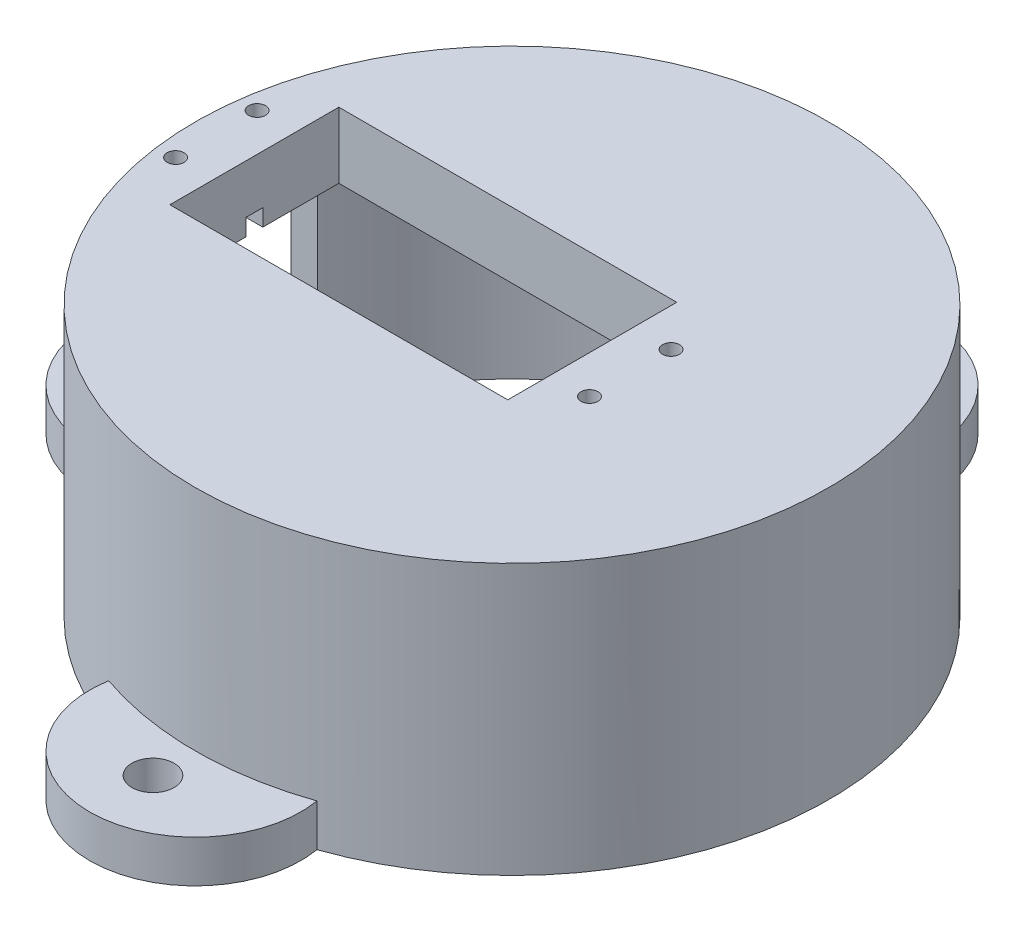
ISO-10303-21;
HEADER;
FILE_DESCRIPTION(('STEP AP214'),'2;1');
FILE_NAME('part.step','',(''),(''),'','','');
FILE_SCHEMA(('AUTOMOTIVE_DESIGN { 1 0 10303 214 1 1 1 1 }'));
ENDSEC;
DATA;
#1=APPLICATION_CONTEXT('core data for automotive mechanical design processes');
#2=APPLICATION_PROTOCOL_DEFINITION('international standard','automotive_design',2000,#1);
#3=PRODUCT_CONTEXT('',#1,'mechanical');
#4=PRODUCT('Part','Part','',(#3));
#5=PRODUCT_RELATED_PRODUCT_CATEGORY('part','',(#4));
#6=PRODUCT_DEFINITION_FORMATION('','',#4);
#7=PRODUCT_DEFINITION_CONTEXT('part definition',#1,'design');
#8=PRODUCT_DEFINITION('design','',#6,#7);
#9=PRODUCT_DEFINITION_SHAPE('','',#8);
#10=(LENGTH_UNIT() NAMED_UNIT(*) SI_UNIT(.MILLI.,.METRE.));
#11=(NAMED_UNIT(*) PLANE_ANGLE_UNIT() SI_UNIT($,.RADIAN.));
#12=(NAMED_UNIT(*) SI_UNIT($,.STERADIAN.) SOLID_ANGLE_UNIT());
#13=UNCERTAINTY_MEASURE_WITH_UNIT(LENGTH_MEASURE(1.E-05),#10,'distance_accuracy_value','');
#14=(GEOMETRIC_REPRESENTATION_CONTEXT(3) GLOBAL_UNCERTAINTY_ASSIGNED_CONTEXT((#13)) GLOBAL_UNIT_ASSIGNED_CONTEXT((#10,
#11,#12)) REPRESENTATION_CONTEXT('',''));
#15=CARTESIAN_POINT('',(0.,0.,0.));
#16=DIRECTION('',(0.,0.,1.));
#17=DIRECTION('',(1.,0.,0.));
#18=AXIS2_PLACEMENT_3D('',#15,#16,#17);
#19=CARTESIAN_POINT('',(-30.5,-44.7213595499958,10.));
#20=DIRECTION('',(0.,0.,1.));
#21=DIRECTION('',(1.,0.,0.));
#22=AXIS2_PLACEMENT_3D('',#19,#20,#21);
#23=PLANE('',#22);
#24=DIRECTION('',(1.,0.,0.));
#25=VECTOR('',#24,1.);
#26=CARTESIAN_POINT('',(-30.5,24.2,10.));
#27=LINE('',#26,#25);
#28=CARTESIAN_POINT('',(-30.5,24.2,10.));
#29=VERTEX_POINT('',#28);
#30=CARTESIAN_POINT('',(9.5,24.2,10.));
#31=VERTEX_POINT('',#30);
#32=EDGE_CURVE('E300',#29,#31,#27,.T.);
#33=ORIENTED_EDGE('',*,*,#32,.F.);
#34=DIRECTION('',(0.,1.,0.));
#35=VECTOR('',#34,1.);
#36=CARTESIAN_POINT('',(-30.5,-44.7213595499958,10.));
#37=LINE('',#36,#35);
#38=CARTESIAN_POINT('',(-30.5,32.,10.));
#39=VERTEX_POINT('',#38);
#40=EDGE_CURVE('E334',#29,#39,#37,.T.);
#41=ORIENTED_EDGE('',*,*,#40,.T.);
#42=DIRECTION('',(1.,0.,0.));
#43=VECTOR('',#42,1.);
#44=CARTESIAN_POINT('',(-30.5,32.,10.));
#45=LINE('',#44,#43);
#46=CARTESIAN_POINT('',(9.5,32.,10.));
#47=VERTEX_POINT('',#46);
#48=EDGE_CURVE('E325',#39,#47,#45,.T.);
#49=ORIENTED_EDGE('',*,*,#48,.T.);
#50=DIRECTION('',(0.,1.,0.));
#51=VECTOR('',#50,1.);
#52=CARTESIAN_POINT('',(9.5,-44.7213595499958,10.));
#53=LINE('',#52,#51);
#54=EDGE_CURVE('E340',#31,#47,#53,.T.);
#55=ORIENTED_EDGE('',*,*,#54,.F.);
#56=EDGE_LOOP('',(#33,#41,#49,#55));
#57=FACE_BOUND('',#56,.T.);
#58=ADVANCED_FACE('F35',(#57),#23,.F.);
#59=CARTESIAN_POINT('',(9.5,-44.7213595499958,-10.));
#60=DIRECTION('',(1.,0.,0.));
#61=DIRECTION('',(0.,0.,-1.));
#62=AXIS2_PLACEMENT_3D('',#59,#60,#61);
#63=PLANE('',#62);
#64=DIRECTION('',(0.,0.,-1.));
#65=VECTOR('',#64,1.);
#66=CARTESIAN_POINT('',(9.5,26.2,1.));
#67=LINE('',#66,#65);
#68=CARTESIAN_POINT('',(9.5,26.2,1.));
#69=VERTEX_POINT('',#68);
#70=CARTESIAN_POINT('',(9.5,26.2,-0.999999999999999));
#71=VERTEX_POINT('',#70);
#72=EDGE_CURVE('E203',#69,#71,#67,.T.);
#73=ORIENTED_EDGE('',*,*,#72,.F.);
#74=DIRECTION('',(0.,-1.,0.));
#75=VECTOR('',#74,1.);
#76=CARTESIAN_POINT('',(9.5,26.2,1.));
#77=LINE('',#76,#75);
#78=CARTESIAN_POINT('',(9.5,24.2,1.));
#79=VERTEX_POINT('',#78);
#80=EDGE_CURVE('E265',#69,#79,#77,.T.);
#81=ORIENTED_EDGE('',*,*,#80,.T.);
#82=DIRECTION('',(0.,0.,-1.));
#83=VECTOR('',#82,1.);
#84=CARTESIAN_POINT('',(9.5,24.2,-10.));
#85=LINE('',#84,#83);
#86=EDGE_CURVE('E297',#31,#79,#85,.T.);
#87=ORIENTED_EDGE('',*,*,#86,.F.);
#88=ORIENTED_EDGE('',*,*,#54,.T.);
#89=DIRECTION('',(0.,0.,-1.));
#90=VECTOR('',#89,1.);
#91=CARTESIAN_POINT('',(9.5,32.,-10.));
#92=LINE('',#91,#90);
#93=CARTESIAN_POINT('',(9.5,32.,-10.));
#94=VERTEX_POINT('',#93);
#95=EDGE_CURVE('E328',#47,#94,#92,.T.);
#96=ORIENTED_EDGE('',*,*,#95,.T.);
#97=DIRECTION('',(0.,1.,0.));
#98=VECTOR('',#97,1.);
#99=CARTESIAN_POINT('',(9.5,-44.7213595499958,-10.));
#100=LINE('',#99,#98);
#101=CARTESIAN_POINT('',(9.5,24.2,-10.));
#102=VERTEX_POINT('',#101);
#103=EDGE_CURVE('E338',#102,#94,#100,.T.);
#104=ORIENTED_EDGE('',*,*,#103,.F.);
#105=CARTESIAN_POINT('',(9.5,24.2,-0.999999999999999));
#106=VERTEX_POINT('',#105);
#107=EDGE_CURVE('E217',#106,#102,#85,.T.);
#108=ORIENTED_EDGE('',*,*,#107,.F.);
#109=DIRECTION('',(0.,-1.,0.));
#110=VECTOR('',#109,1.);
#111=CARTESIAN_POINT('',(9.5,26.2,-0.999999999999999));
#112=LINE('',#111,#110);
#113=EDGE_CURVE('E58',#71,#106,#112,.T.);
#114=ORIENTED_EDGE('',*,*,#113,.F.);
#115=EDGE_LOOP('',(#73,#81,#87,#88,#96,#104,#108,#114));
#116=FACE_BOUND('',#115,.T.);
#117=ADVANCED_FACE('F215',(#116),#63,.F.);
#118=CARTESIAN_POINT('',(-30.5,-44.7213595499958,-10.));
#119=DIRECTION('',(0.,0.,-1.));
#120=DIRECTION('',(-1.,0.,0.));
#121=AXIS2_PLACEMENT_3D('',#118,#119,#120);
#122=PLANE('',#121);
#123=DIRECTION('',(-1.,0.,0.));
#124=VECTOR('',#123,1.);
#125=CARTESIAN_POINT('',(-30.5,24.2,-10.));
#126=LINE('',#125,#124);
#127=CARTESIAN_POINT('',(-30.5,24.2,-10.));
#128=VERTEX_POINT('',#127);
#129=EDGE_CURVE('E295',#102,#128,#126,.T.);
#130=ORIENTED_EDGE('',*,*,#129,.F.);
#131=ORIENTED_EDGE('',*,*,#103,.T.);
#132=DIRECTION('',(-1.,0.,0.));
#133=VECTOR('',#132,1.);
#134=CARTESIAN_POINT('',(-30.5,32.,-10.));
#135=LINE('',#134,#133);
#136=CARTESIAN_POINT('',(-30.5,32.,-10.));
#137=VERTEX_POINT('',#136);
#138=EDGE_CURVE('E331',#94,#137,#135,.T.);
#139=ORIENTED_EDGE('',*,*,#138,.T.);
#140=DIRECTION('',(0.,1.,0.));
#141=VECTOR('',#140,1.);
#142=CARTESIAN_POINT('',(-30.5,-44.7213595499958,-10.));
#143=LINE('',#142,#141);
#144=EDGE_CURVE('E335',#128,#137,#143,.T.);
#145=ORIENTED_EDGE('',*,*,#144,.F.);
#146=EDGE_LOOP('',(#130,#131,#139,#145));
#147=FACE_BOUND('',#146,.T.);
#148=ADVANCED_FACE('F480',(#147),#122,.F.);
#149=CARTESIAN_POINT('',(-30.5,-44.7213595499958,-10.));
#150=DIRECTION('',(-1.,0.,0.));
#151=DIRECTION('',(0.,0.,1.));
#152=AXIS2_PLACEMENT_3D('',#149,#150,#151);
#153=PLANE('',#152);
#154=DIRECTION('',(0.,0.,1.));
#155=VECTOR('',#154,1.);
#156=CARTESIAN_POINT('',(-30.5,26.2,1.));
#157=LINE('',#156,#155);
#158=CARTESIAN_POINT('',(-30.5,26.2,-0.999999999999997));
#159=VERTEX_POINT('',#158);
#160=CARTESIAN_POINT('',(-30.5,26.2,1.));
#161=VERTEX_POINT('',#160);
#162=EDGE_CURVE('E224',#159,#161,#157,.T.);
#163=ORIENTED_EDGE('',*,*,#162,.F.);
#164=DIRECTION('',(0.,-1.,0.));
#165=VECTOR('',#164,1.);
#166=CARTESIAN_POINT('',(-30.5,26.2,-0.999999999999997));
#167=LINE('',#166,#165);
#168=CARTESIAN_POINT('',(-30.5,24.2,-0.999999999999997));
#169=VERTEX_POINT('',#168);
#170=EDGE_CURVE('E243',#159,#169,#167,.T.);
#171=ORIENTED_EDGE('',*,*,#170,.T.);
#172=DIRECTION('',(0.,0.,1.));
#173=VECTOR('',#172,1.);
#174=CARTESIAN_POINT('',(-30.5,24.2,-10.));
#175=LINE('',#174,#173);
#176=EDGE_CURVE('E292',#128,#169,#175,.T.);
#177=ORIENTED_EDGE('',*,*,#176,.F.);
#178=ORIENTED_EDGE('',*,*,#144,.T.);
#179=DIRECTION('',(0.,0.,1.));
#180=VECTOR('',#179,1.);
#181=CARTESIAN_POINT('',(-30.5,32.,-10.));
#182=LINE('',#181,#180);
#183=EDGE_CURVE('E314',#137,#39,#182,.T.);
#184=ORIENTED_EDGE('',*,*,#183,.T.);
#185=ORIENTED_EDGE('',*,*,#40,.F.);
#186=CARTESIAN_POINT('',(-30.5,24.2,1.));
#187=VERTEX_POINT('',#186);
#188=EDGE_CURVE('E291',#187,#29,#175,.T.);
#189=ORIENTED_EDGE('',*,*,#188,.F.);
#190=DIRECTION('',(0.,-1.,0.));
#191=VECTOR('',#190,1.);
#192=CARTESIAN_POINT('',(-30.5,26.2,1.));
#193=LINE('',#192,#191);
#194=EDGE_CURVE('E50',#161,#187,#193,.T.);
#195=ORIENTED_EDGE('',*,*,#194,.F.);
#196=EDGE_LOOP('',(#163,#171,#177,#178,#184,#185,#189,#195));
#197=FACE_BOUND('',#196,.T.);
#198=ADVANCED_FACE('F485',(#197),#153,.F.);
#199=CARTESIAN_POINT('',(-35.,-44.7213595499958,-4.825));
#200=DIRECTION('',(0.,1.,0.));
#201=DIRECTION('',(0.,0.,1.));
#202=AXIS2_PLACEMENT_3D('',#199,#200,#201);
#203=CYLINDRICAL_SURFACE('',#202,0.999999999999998);
#204=CARTESIAN_POINT('',(-35.,32.,-4.825));
#205=DIRECTION('',(0.,1.,0.));
#206=DIRECTION('',(0.,0.,1.));
#207=AXIS2_PLACEMENT_3D('',#204,#205,#206);
#208=CIRCLE('',#207,0.999999999999998);
#209=CARTESIAN_POINT('',(-35.,32.,-3.825));
#210=VERTEX_POINT('',#209);
#211=EDGE_CURVE('E311',#210,#210,#208,.T.);
#212=ORIENTED_EDGE('',*,*,#211,.T.);
#213=EDGE_LOOP('',(#212));
#214=FACE_BOUND('',#213,.T.);
#215=CARTESIAN_POINT('',(-35.,24.2,-4.825));
#216=DIRECTION('',(0.,-1.,0.));
#217=DIRECTION('',(0.,0.,-1.));
#218=AXIS2_PLACEMENT_3D('',#215,#216,#217);
#219=CIRCLE('',#218,0.999999999999998);
#220=CARTESIAN_POINT('',(-35.,24.2,-5.825));
#221=VERTEX_POINT('',#220);
#222=EDGE_CURVE('E288',#221,#221,#219,.F.);
#223=ORIENTED_EDGE('',*,*,#222,.F.);
#224=EDGE_LOOP('',(#223));
#225=FACE_BOUND('',#224,.T.);
#226=ADVANCED_FACE('F487',(#214,#225),#203,.F.);
#227=CARTESIAN_POINT('',(-35.,-44.7213595499958,4.825));
#228=DIRECTION('',(0.,1.,0.));
#229=DIRECTION('',(0.,0.,1.));
#230=AXIS2_PLACEMENT_3D('',#227,#228,#229);
#231=CYLINDRICAL_SURFACE('',#230,0.999999999999998);
#232=CARTESIAN_POINT('',(-35.,32.,4.825));
#233=DIRECTION('',(0.,1.,0.));
#234=DIRECTION('',(0.,0.,1.));
#235=AXIS2_PLACEMENT_3D('',#232,#233,#234);
#236=CIRCLE('',#235,0.999999999999998);
#237=CARTESIAN_POINT('',(-35.,32.,5.825));
#238=VERTEX_POINT('',#237);
#239=EDGE_CURVE('E315',#238,#238,#236,.T.);
#240=ORIENTED_EDGE('',*,*,#239,.T.);
#241=EDGE_LOOP('',(#240));
#242=FACE_BOUND('',#241,.T.);
#243=CARTESIAN_POINT('',(-35.,24.2,4.825));
#244=DIRECTION('',(0.,-1.,0.));
#245=DIRECTION('',(0.,0.,-1.));
#246=AXIS2_PLACEMENT_3D('',#243,#244,#245);
#247=CIRCLE('',#246,0.999999999999998);
#248=CARTESIAN_POINT('',(-35.,24.2,3.825));
#249=VERTEX_POINT('',#248);
#250=EDGE_CURVE('E285',#249,#249,#247,.F.);
#251=ORIENTED_EDGE('',*,*,#250,.F.);
#252=EDGE_LOOP('',(#251));
#253=FACE_BOUND('',#252,.T.);
#254=ADVANCED_FACE('F493',(#242,#253),#231,.F.);
#255=CARTESIAN_POINT('',(14.,-44.7213595499958,-4.825));
#256=DIRECTION('',(0.,1.,0.));
#257=DIRECTION('',(0.,0.,1.));
#258=AXIS2_PLACEMENT_3D('',#255,#256,#257);
#259=CYLINDRICAL_SURFACE('',#258,1.);
#260=CARTESIAN_POINT('',(14.,32.,-4.825));
#261=DIRECTION('',(0.,1.,0.));
#262=DIRECTION('',(0.,0.,1.));
#263=AXIS2_PLACEMENT_3D('',#260,#261,#262);
#264=CIRCLE('',#263,1.);
#265=CARTESIAN_POINT('',(14.,32.,-3.825));
#266=VERTEX_POINT('',#265);
#267=EDGE_CURVE('E318',#266,#266,#264,.T.);
#268=ORIENTED_EDGE('',*,*,#267,.T.);
#269=EDGE_LOOP('',(#268));
#270=FACE_BOUND('',#269,.T.);
#271=CARTESIAN_POINT('',(14.,24.2,-4.825));
#272=DIRECTION('',(0.,-1.,0.));
#273=DIRECTION('',(0.,0.,-1.));
#274=AXIS2_PLACEMENT_3D('',#271,#272,#273);
#275=CIRCLE('',#274,1.);
#276=CARTESIAN_POINT('',(14.,24.2,-5.825));
#277=VERTEX_POINT('',#276);
#278=EDGE_CURVE('E282',#277,#277,#275,.F.);
#279=ORIENTED_EDGE('',*,*,#278,.F.);
#280=EDGE_LOOP('',(#279));
#281=FACE_BOUND('',#280,.T.);
#282=ADVANCED_FACE('F567',(#270,#281),#259,.F.);
#283=CARTESIAN_POINT('',(14.,-44.7213595499958,4.825));
#284=DIRECTION('',(0.,1.,0.));
#285=DIRECTION('',(0.,0.,1.));
#286=AXIS2_PLACEMENT_3D('',#283,#284,#285);
#287=CYLINDRICAL_SURFACE('',#286,1.);
#288=CARTESIAN_POINT('',(14.,32.,4.825));
#289=DIRECTION('',(0.,1.,0.));
#290=DIRECTION('',(0.,0.,1.));
#291=AXIS2_PLACEMENT_3D('',#288,#289,#290);
#292=CIRCLE('',#291,1.);
#293=CARTESIAN_POINT('',(14.,32.,5.825));
#294=VERTEX_POINT('',#293);
#295=EDGE_CURVE('E310',#294,#294,#292,.T.);
#296=ORIENTED_EDGE('',*,*,#295,.T.);
#297=EDGE_LOOP('',(#296));
#298=FACE_BOUND('',#297,.T.);
#299=CARTESIAN_POINT('',(14.,24.2,4.825));
#300=DIRECTION('',(0.,-1.,0.));
#301=DIRECTION('',(0.,0.,-1.));
#302=AXIS2_PLACEMENT_3D('',#299,#300,#301);
#303=CIRCLE('',#302,1.);
#304=CARTESIAN_POINT('',(14.,24.2,3.825));
#305=VERTEX_POINT('',#304);
#306=EDGE_CURVE('E275',#305,#305,#303,.F.);
#307=ORIENTED_EDGE('',*,*,#306,.F.);
#308=EDGE_LOOP('',(#307));
#309=FACE_BOUND('',#308,.T.);
#310=ADVANCED_FACE('F571',(#298,#309),#287,.F.);
#311=CARTESIAN_POINT('',(0.,32.,0.));
#312=DIRECTION('',(0.,-1.,0.));
#313=DIRECTION('',(0.,0.,-1.));
#314=AXIS2_PLACEMENT_3D('',#311,#312,#313);
#315=CYLINDRICAL_SURFACE('',#314,37.5);
#316=CARTESIAN_POINT('',(0.,5.,0.));
#317=DIRECTION('',(0.,1.,0.));
#318=DIRECTION('',(0.,0.,1.));
#319=AXIS2_PLACEMENT_3D('',#316,#317,#318);
#320=CIRCLE('',#319,37.5);
#321=CARTESIAN_POINT('',(-35.4166666666667,5.,-12.3251662147909));
#322=VERTEX_POINT('',#321);
#323=CARTESIAN_POINT('',(-36.1420807370024,5.,-10.));
#324=VERTEX_POINT('',#323);
#325=EDGE_CURVE('E383',#322,#324,#320,.T.);
#326=ORIENTED_EDGE('',*,*,#325,.T.);
#327=DIRECTION('',(0.,-1.,0.));
#328=VECTOR('',#327,1.);
#329=CARTESIAN_POINT('',(-36.1420807370024,32.,-10.));
#330=LINE('',#329,#328);
#331=CARTESIAN_POINT('',(-36.1420807370024,24.2,-10.));
#332=VERTEX_POINT('',#331);
#333=EDGE_CURVE('E307',#324,#332,#330,.F.);
#334=ORIENTED_EDGE('',*,*,#333,.T.);
#335=CARTESIAN_POINT('',(0.,24.2,0.));
#336=DIRECTION('',(0.,-1.,0.));
#337=DIRECTION('',(0.,0.,-1.));
#338=AXIS2_PLACEMENT_3D('',#335,#336,#337);
#339=CIRCLE('',#338,37.5);
#340=CARTESIAN_POINT('',(-36.1420807370024,24.2,10.));
#341=VERTEX_POINT('',#340);
#342=EDGE_CURVE('E302',#341,#332,#339,.T.);
#343=ORIENTED_EDGE('',*,*,#342,.F.);
#344=DIRECTION('',(0.,-1.,0.));
#345=VECTOR('',#344,1.);
#346=CARTESIAN_POINT('',(-36.1420807370024,32.,10.));
#347=LINE('',#346,#345);
#348=CARTESIAN_POINT('',(-36.1420807370024,5.,10.));
#349=VERTEX_POINT('',#348);
#350=EDGE_CURVE('E304',#341,#349,#347,.T.);
#351=ORIENTED_EDGE('',*,*,#350,.T.);
#352=CARTESIAN_POINT('',(-35.4166666666667,5.,12.3251662147909));
#353=VERTEX_POINT('',#352);
#354=EDGE_CURVE('E387',#349,#353,#320,.T.);
#355=ORIENTED_EDGE('',*,*,#354,.T.);
#356=DIRECTION('',(0.,-1.,0.));
#357=VECTOR('',#356,1.);
#358=CARTESIAN_POINT('',(-35.4166666666667,5.,12.3251662147909));
#359=LINE('',#358,#357);
#360=CARTESIAN_POINT('',(-35.4166666666667,0.,12.3251662147909));
#361=VERTEX_POINT('',#360);
#362=EDGE_CURVE('E393',#353,#361,#359,.T.);
#363=ORIENTED_EDGE('',*,*,#362,.T.);
#364=CARTESIAN_POINT('',(0.,0.,0.));
#365=DIRECTION('',(0.,1.,0.));
#366=DIRECTION('',(0.,0.,1.));
#367=AXIS2_PLACEMENT_3D('',#364,#365,#366);
#368=CIRCLE('',#367,37.5);
#369=CARTESIAN_POINT('',(-12.3251662147909,0.,35.4166666666667));
#370=VERTEX_POINT('',#369);
#371=EDGE_CURVE('E409',#361,#370,#368,.T.);
#372=ORIENTED_EDGE('',*,*,#371,.T.);
#373=DIRECTION('',(0.,-1.,0.));
#374=VECTOR('',#373,1.);
#375=CARTESIAN_POINT('',(-12.3251662147909,5.,35.4166666666667));
#376=LINE('',#375,#374);
#377=CARTESIAN_POINT('',(-12.3251662147909,5.,35.4166666666667));
#378=VERTEX_POINT('',#377);
#379=EDGE_CURVE('E379',#378,#370,#376,.T.);
#380=ORIENTED_EDGE('',*,*,#379,.F.);
#381=CARTESIAN_POINT('',(0.,5.,0.));
#382=DIRECTION('',(0.,1.,0.));
#383=DIRECTION('',(0.,0.,1.));
#384=AXIS2_PLACEMENT_3D('',#381,#382,#383);
#385=CIRCLE('',#384,37.5);
#386=CARTESIAN_POINT('',(12.3251662147909,5.,35.4166666666667));
#387=VERTEX_POINT('',#386);
#388=EDGE_CURVE('E363',#378,#387,#385,.T.);
#389=ORIENTED_EDGE('',*,*,#388,.T.);
#390=DIRECTION('',(0.,-1.,0.));
#391=VECTOR('',#390,1.);
#392=CARTESIAN_POINT('',(12.3251662147909,5.,35.4166666666667));
#393=LINE('',#392,#391);
#394=CARTESIAN_POINT('',(12.3251662147909,0.,35.4166666666667));
#395=VERTEX_POINT('',#394);
#396=EDGE_CURVE('E372',#387,#395,#393,.T.);
#397=ORIENTED_EDGE('',*,*,#396,.T.);
#398=CARTESIAN_POINT('',(12.3251662147909,0.,-35.4166666666667));
#399=VERTEX_POINT('',#398);
#400=EDGE_CURVE('E411',#395,#399,#368,.T.);
#401=ORIENTED_EDGE('',*,*,#400,.T.);
#402=DIRECTION('',(0.,-1.,0.));
#403=VECTOR('',#402,1.);
#404=CARTESIAN_POINT('',(12.3251662147909,5.,-35.4166666666667));
#405=LINE('',#404,#403);
#406=CARTESIAN_POINT('',(12.3251662147909,5.,-35.4166666666667));
#407=VERTEX_POINT('',#406);
#408=EDGE_CURVE('E359',#407,#399,#405,.T.);
#409=ORIENTED_EDGE('',*,*,#408,.F.);
#410=CARTESIAN_POINT('',(0.,5.,0.));
#411=DIRECTION('',(0.,1.,0.));
#412=DIRECTION('',(0.,0.,1.));
#413=AXIS2_PLACEMENT_3D('',#410,#411,#412);
#414=CIRCLE('',#413,37.5);
#415=CARTESIAN_POINT('',(-12.3251662147909,5.,-35.4166666666667));
#416=VERTEX_POINT('',#415);
#417=EDGE_CURVE('E343',#407,#416,#414,.T.);
#418=ORIENTED_EDGE('',*,*,#417,.T.);
#419=DIRECTION('',(0.,-1.,0.));
#420=VECTOR('',#419,1.);
#421=CARTESIAN_POINT('',(-12.3251662147909,5.,-35.4166666666667));
#422=LINE('',#421,#420);
#423=CARTESIAN_POINT('',(-12.3251662147909,0.,-35.4166666666667));
#424=VERTEX_POINT('',#423);
#425=EDGE_CURVE('E352',#416,#424,#422,.T.);
#426=ORIENTED_EDGE('',*,*,#425,.T.);
#427=CARTESIAN_POINT('',(-35.4166666666667,0.,-12.3251662147909));
#428=VERTEX_POINT('',#427);
#429=EDGE_CURVE('E404',#424,#428,#368,.T.);
#430=ORIENTED_EDGE('',*,*,#429,.T.);
#431=DIRECTION('',(0.,-1.,0.));
#432=VECTOR('',#431,1.);
#433=CARTESIAN_POINT('',(-35.4166666666667,5.,-12.3251662147909));
#434=LINE('',#433,#432);
#435=EDGE_CURVE('E401',#322,#428,#434,.T.);
#436=ORIENTED_EDGE('',*,*,#435,.F.);
#437=EDGE_LOOP('',(#326,#334,#343,#351,#355,#363,#372,#380,#389,#397,#401,#409,#418,#426,#430,#436));
#438=FACE_BOUND('',#437,.T.);
#439=CARTESIAN_POINT('',(0.,32.,0.));
#440=DIRECTION('',(0.,1.,0.));
#441=DIRECTION('',(0.,0.,1.));
#442=AXIS2_PLACEMENT_3D('',#439,#440,#441);
#443=CIRCLE('',#442,37.5);
#444=CARTESIAN_POINT('',(0.,32.,37.5));
#445=VERTEX_POINT('',#444);
#446=EDGE_CURVE('E405',#445,#445,#443,.T.);
#447=ORIENTED_EDGE('',*,*,#446,.F.);
#448=EDGE_LOOP('',(#447));
#449=FACE_BOUND('',#448,.T.);
#450=ADVANCED_FACE('F37',(#438,#449),#315,.T.);
#451=CARTESIAN_POINT('',(0.,32.,0.));
#452=DIRECTION('',(0.,1.,0.));
#453=DIRECTION('',(0.,0.,1.));
#454=AXIS2_PLACEMENT_3D('',#451,#452,#453);
#455=PLANE('',#454);
#456=ORIENTED_EDGE('',*,*,#295,.F.);
#457=EDGE_LOOP('',(#456));
#458=FACE_BOUND('',#457,.T.);
#459=ORIENTED_EDGE('',*,*,#267,.F.);
#460=EDGE_LOOP('',(#459));
#461=FACE_BOUND('',#460,.T.);
#462=ORIENTED_EDGE('',*,*,#239,.F.);
#463=EDGE_LOOP('',(#462));
#464=FACE_BOUND('',#463,.T.);
#465=ORIENTED_EDGE('',*,*,#211,.F.);
#466=EDGE_LOOP('',(#465));
#467=FACE_BOUND('',#466,.T.);
#468=ORIENTED_EDGE('',*,*,#48,.F.);
#469=ORIENTED_EDGE('',*,*,#183,.F.);
#470=ORIENTED_EDGE('',*,*,#138,.F.);
#471=ORIENTED_EDGE('',*,*,#95,.F.);
#472=EDGE_LOOP('',(#468,#469,#470,#471));
#473=FACE_BOUND('',#472,.T.);
#474=ORIENTED_EDGE('',*,*,#446,.T.);
#475=EDGE_LOOP('',(#474));
#476=FACE_BOUND('',#475,.T.);
#477=ADVANCED_FACE('F449',(#458,#461,#464,#467,#473,#476),#455,.T.);
#478=CARTESIAN_POINT('',(0.,0.,0.));
#479=DIRECTION('',(0.,1.,0.));
#480=DIRECTION('',(0.,0.,1.));
#481=AXIS2_PLACEMENT_3D('',#478,#479,#480);
#482=PLANE('',#481);
#483=DIRECTION('',(-1.,0.,0.));
#484=VECTOR('',#483,1.);
#485=CARTESIAN_POINT('',(-33.0189339621981,0.,10.));
#486=LINE('',#485,#484);
#487=CARTESIAN_POINT('',(-33.0189339621981,0.,10.));
#488=VERTEX_POINT('',#487);
#489=CARTESIAN_POINT('',(-38.0189339621981,0.,10.));
#490=VERTEX_POINT('',#489);
#491=EDGE_CURVE('E264',#488,#490,#486,.T.);
#492=ORIENTED_EDGE('',*,*,#491,.F.);
#493=CARTESIAN_POINT('',(0.,0.,0.));
#494=DIRECTION('',(0.,-1.,0.));
#495=DIRECTION('',(0.,0.,-1.));
#496=AXIS2_PLACEMENT_3D('',#493,#494,#495);
#497=CIRCLE('',#496,34.5);
#498=CARTESIAN_POINT('',(-33.0189339621981,0.,-10.));
#499=VERTEX_POINT('',#498);
#500=EDGE_CURVE('E262',#499,#488,#497,.T.);
#501=ORIENTED_EDGE('',*,*,#500,.F.);
#502=DIRECTION('',(1.,0.,0.));
#503=VECTOR('',#502,1.);
#504=CARTESIAN_POINT('',(-33.0189339621981,0.,-10.));
#505=LINE('',#504,#503);
#506=CARTESIAN_POINT('',(-38.0189339621981,0.,-10.));
#507=VERTEX_POINT('',#506);
#508=EDGE_CURVE('E256',#507,#499,#505,.T.);
#509=ORIENTED_EDGE('',*,*,#508,.F.);
#510=DIRECTION('',(0.,0.,-1.));
#511=VECTOR('',#510,1.);
#512=CARTESIAN_POINT('',(-38.0189339621981,0.,10.));
#513=LINE('',#512,#511);
#514=EDGE_CURVE('E268',#490,#507,#513,.T.);
#515=ORIENTED_EDGE('',*,*,#514,.F.);
#516=EDGE_LOOP('',(#492,#501,#509,#515));
#517=FACE_BOUND('',#516,.T.);
#518=ORIENTED_EDGE('',*,*,#371,.F.);
#519=CARTESIAN_POINT('',(-37.5,0.,0.));
#520=DIRECTION('',(0.,1.,0.));
#521=DIRECTION('',(0.,0.,1.));
#522=AXIS2_PLACEMENT_3D('',#519,#520,#521);
#523=CIRCLE('',#522,12.5);
#524=EDGE_CURVE('E382',#428,#361,#523,.T.);
#525=ORIENTED_EDGE('',*,*,#524,.F.);
#526=ORIENTED_EDGE('',*,*,#429,.F.);
#527=CARTESIAN_POINT('',(0.,0.,-37.5));
#528=DIRECTION('',(0.,1.,0.));
#529=DIRECTION('',(0.,0.,1.));
#530=AXIS2_PLACEMENT_3D('',#527,#528,#529);
#531=CIRCLE('',#530,12.5);
#532=EDGE_CURVE('E337',#399,#424,#531,.T.);
#533=ORIENTED_EDGE('',*,*,#532,.F.);
#534=ORIENTED_EDGE('',*,*,#400,.F.);
#535=CARTESIAN_POINT('',(0.,0.,37.5));
#536=DIRECTION('',(0.,1.,0.));
#537=DIRECTION('',(0.,0.,1.));
#538=AXIS2_PLACEMENT_3D('',#535,#536,#537);
#539=CIRCLE('',#538,12.5);
#540=EDGE_CURVE('E362',#370,#395,#539,.T.);
#541=ORIENTED_EDGE('',*,*,#540,.F.);
#542=EDGE_LOOP('',(#518,#525,#526,#533,#534,#541));
#543=FACE_BOUND('',#542,.T.);
#544=CARTESIAN_POINT('',(-42.5,0.,0.));
#545=DIRECTION('',(0.,1.,0.));
#546=DIRECTION('',(0.,0.,1.));
#547=AXIS2_PLACEMENT_3D('',#544,#545,#546);
#548=CIRCLE('',#547,2.5);
#549=CARTESIAN_POINT('',(-42.5,0.,2.5));
#550=VERTEX_POINT('',#549);
#551=EDGE_CURVE('E396',#550,#550,#548,.T.);
#552=ORIENTED_EDGE('',*,*,#551,.T.);
#553=EDGE_LOOP('',(#552));
#554=FACE_BOUND('',#553,.T.);
#555=CARTESIAN_POINT('',(0.,0.,42.5));
#556=DIRECTION('',(0.,1.,0.));
#557=DIRECTION('',(0.,0.,1.));
#558=AXIS2_PLACEMENT_3D('',#555,#556,#557);
#559=CIRCLE('',#558,2.5);
#560=CARTESIAN_POINT('',(0.,0.,45.));
#561=VERTEX_POINT('',#560);
#562=EDGE_CURVE('E366',#561,#561,#559,.T.);
#563=ORIENTED_EDGE('',*,*,#562,.T.);
#564=EDGE_LOOP('',(#563));
#565=FACE_BOUND('',#564,.T.);
#566=CARTESIAN_POINT('',(0.,0.,-42.5));
#567=DIRECTION('',(0.,1.,0.));
#568=DIRECTION('',(0.,0.,1.));
#569=AXIS2_PLACEMENT_3D('',#566,#567,#568);
#570=CIRCLE('',#569,2.5);
#571=CARTESIAN_POINT('',(0.,0.,-40.));
#572=VERTEX_POINT('',#571);
#573=EDGE_CURVE('E346',#572,#572,#570,.T.);
#574=ORIENTED_EDGE('',*,*,#573,.T.);
#575=EDGE_LOOP('',(#574));
#576=FACE_BOUND('',#575,.T.);
#577=ADVANCED_FACE('F445',(#517,#543,#554,#565,#576),#482,.F.);
#578=CARTESIAN_POINT('',(-37.5,5.,0.));
#579=DIRECTION('',(0.,-1.,0.));
#580=DIRECTION('',(0.,0.,-1.));
#581=AXIS2_PLACEMENT_3D('',#578,#579,#580);
#582=CYLINDRICAL_SURFACE('',#581,12.5);
#583=ORIENTED_EDGE('',*,*,#524,.T.);
#584=ORIENTED_EDGE('',*,*,#362,.F.);
#585=CARTESIAN_POINT('',(-37.5,5.,0.));
#586=DIRECTION('',(0.,1.,0.));
#587=DIRECTION('',(0.,0.,1.));
#588=AXIS2_PLACEMENT_3D('',#585,#586,#587);
#589=CIRCLE('',#588,12.5);
#590=EDGE_CURVE('E386',#322,#353,#589,.T.);
#591=ORIENTED_EDGE('',*,*,#590,.F.);
#592=ORIENTED_EDGE('',*,*,#435,.T.);
#593=EDGE_LOOP('',(#583,#584,#591,#592));
#594=FACE_BOUND('',#593,.T.);
#595=ADVANCED_FACE('F448',(#594),#582,.T.);
#596=CARTESIAN_POINT('',(-42.5,5.,0.));
#597=DIRECTION('',(0.,-1.,0.));
#598=DIRECTION('',(0.,0.,-1.));
#599=AXIS2_PLACEMENT_3D('',#596,#597,#598);
#600=CYLINDRICAL_SURFACE('',#599,2.5);
#601=CARTESIAN_POINT('',(-42.5,5.,0.));
#602=DIRECTION('',(0.,1.,0.));
#603=DIRECTION('',(0.,0.,1.));
#604=AXIS2_PLACEMENT_3D('',#601,#602,#603);
#605=CIRCLE('',#604,2.5);
#606=CARTESIAN_POINT('',(-42.5,5.,2.5));
#607=VERTEX_POINT('',#606);
#608=EDGE_CURVE('E390',#607,#607,#605,.T.);
#609=ORIENTED_EDGE('',*,*,#608,.T.);
#610=EDGE_LOOP('',(#609));
#611=FACE_BOUND('',#610,.T.);
#612=ORIENTED_EDGE('',*,*,#551,.F.);
#613=EDGE_LOOP('',(#612));
#614=FACE_BOUND('',#613,.T.);
#615=ADVANCED_FACE('F604',(#611,#614),#600,.F.);
#616=CARTESIAN_POINT('',(0.,5.,0.));
#617=DIRECTION('',(0.,1.,0.));
#618=DIRECTION('',(0.,0.,1.));
#619=AXIS2_PLACEMENT_3D('',#616,#617,#618);
#620=PLANE('',#619);
#621=DIRECTION('',(-1.,0.,0.));
#622=VECTOR('',#621,1.);
#623=CARTESIAN_POINT('',(0.,5.,-10.));
#624=LINE('',#623,#622);
#625=CARTESIAN_POINT('',(-38.0189339621981,5.,-10.));
#626=VERTEX_POINT('',#625);
#627=EDGE_CURVE('E11',#324,#626,#624,.T.);
#628=ORIENTED_EDGE('',*,*,#627,.F.);
#629=ORIENTED_EDGE('',*,*,#325,.F.);
#630=ORIENTED_EDGE('',*,*,#590,.T.);
#631=ORIENTED_EDGE('',*,*,#354,.F.);
#632=DIRECTION('',(1.,0.,0.));
#633=VECTOR('',#632,1.);
#634=CARTESIAN_POINT('',(0.,5.,10.));
#635=LINE('',#634,#633);
#636=CARTESIAN_POINT('',(-38.0189339621981,5.,10.));
#637=VERTEX_POINT('',#636);
#638=EDGE_CURVE('E408',#637,#349,#635,.T.);
#639=ORIENTED_EDGE('',*,*,#638,.F.);
#640=DIRECTION('',(0.,0.,1.));
#641=VECTOR('',#640,1.);
#642=CARTESIAN_POINT('',(-38.0189339621981,5.,0.));
#643=LINE('',#642,#641);
#644=EDGE_CURVE('E43',#626,#637,#643,.T.);
#645=ORIENTED_EDGE('',*,*,#644,.F.);
#646=EDGE_LOOP('',(#628,#629,#630,#631,#639,#645));
#647=FACE_BOUND('',#646,.T.);
#648=ORIENTED_EDGE('',*,*,#608,.F.);
#649=EDGE_LOOP('',(#648));
#650=FACE_BOUND('',#649,.T.);
#651=ADVANCED_FACE('F423',(#647,#650),#620,.T.);
#652=CARTESIAN_POINT('',(0.,5.,37.5));
#653=DIRECTION('',(0.,-1.,0.));
#654=DIRECTION('',(0.,0.,-1.));
#655=AXIS2_PLACEMENT_3D('',#652,#653,#654);
#656=CYLINDRICAL_SURFACE('',#655,12.5);
#657=ORIENTED_EDGE('',*,*,#540,.T.);
#658=ORIENTED_EDGE('',*,*,#396,.F.);
#659=CARTESIAN_POINT('',(0.,5.,37.5));
#660=DIRECTION('',(0.,1.,0.));
#661=DIRECTION('',(0.,0.,1.));
#662=AXIS2_PLACEMENT_3D('',#659,#660,#661);
#663=CIRCLE('',#662,12.5);
#664=EDGE_CURVE('E365',#378,#387,#663,.T.);
#665=ORIENTED_EDGE('',*,*,#664,.F.);
#666=ORIENTED_EDGE('',*,*,#379,.T.);
#667=EDGE_LOOP('',(#657,#658,#665,#666));
#668=FACE_BOUND('',#667,.T.);
#669=ADVANCED_FACE('F611',(#668),#656,.T.);
#670=CARTESIAN_POINT('',(0.,5.,42.5));
#671=DIRECTION('',(0.,-1.,0.));
#672=DIRECTION('',(0.,0.,-1.));
#673=AXIS2_PLACEMENT_3D('',#670,#671,#672);
#674=CYLINDRICAL_SURFACE('',#673,2.5);
#675=CARTESIAN_POINT('',(0.,5.,42.5));
#676=DIRECTION('',(0.,1.,0.));
#677=DIRECTION('',(0.,0.,1.));
#678=AXIS2_PLACEMENT_3D('',#675,#676,#677);
#679=CIRCLE('',#678,2.5);
#680=CARTESIAN_POINT('',(0.,5.,45.));
#681=VERTEX_POINT('',#680);
#682=EDGE_CURVE('E369',#681,#681,#679,.T.);
#683=ORIENTED_EDGE('',*,*,#682,.T.);
#684=EDGE_LOOP('',(#683));
#685=FACE_BOUND('',#684,.T.);
#686=ORIENTED_EDGE('',*,*,#562,.F.);
#687=EDGE_LOOP('',(#686));
#688=FACE_BOUND('',#687,.T.);
#689=ADVANCED_FACE('F614',(#685,#688),#674,.F.);
#690=CARTESIAN_POINT('',(0.,5.,0.));
#691=DIRECTION('',(0.,1.,0.));
#692=DIRECTION('',(0.,0.,1.));
#693=AXIS2_PLACEMENT_3D('',#690,#691,#692);
#694=PLANE('',#693);
#695=ORIENTED_EDGE('',*,*,#388,.F.);
#696=ORIENTED_EDGE('',*,*,#664,.T.);
#697=EDGE_LOOP('',(#695,#696));
#698=FACE_BOUND('',#697,.T.);
#699=ORIENTED_EDGE('',*,*,#682,.F.);
#700=EDGE_LOOP('',(#699));
#701=FACE_BOUND('',#700,.T.);
#702=ADVANCED_FACE('F471',(#698,#701),#694,.T.);
#703=CARTESIAN_POINT('',(0.,5.,-37.5));
#704=DIRECTION('',(0.,-1.,0.));
#705=DIRECTION('',(0.,0.,-1.));
#706=AXIS2_PLACEMENT_3D('',#703,#704,#705);
#707=CYLINDRICAL_SURFACE('',#706,12.5);
#708=ORIENTED_EDGE('',*,*,#532,.T.);
#709=ORIENTED_EDGE('',*,*,#425,.F.);
#710=CARTESIAN_POINT('',(0.,5.,-37.5));
#711=DIRECTION('',(0.,1.,0.));
#712=DIRECTION('',(0.,0.,1.));
#713=AXIS2_PLACEMENT_3D('',#710,#711,#712);
#714=CIRCLE('',#713,12.5);
#715=EDGE_CURVE('E345',#407,#416,#714,.T.);
#716=ORIENTED_EDGE('',*,*,#715,.F.);
#717=ORIENTED_EDGE('',*,*,#408,.T.);
#718=EDGE_LOOP('',(#708,#709,#716,#717));
#719=FACE_BOUND('',#718,.T.);
#720=ADVANCED_FACE('F462',(#719),#707,.T.);
#721=CARTESIAN_POINT('',(0.,5.,-42.5));
#722=DIRECTION('',(0.,-1.,0.));
#723=DIRECTION('',(0.,0.,-1.));
#724=AXIS2_PLACEMENT_3D('',#721,#722,#723);
#725=CYLINDRICAL_SURFACE('',#724,2.5);
#726=CARTESIAN_POINT('',(0.,5.,-42.5));
#727=DIRECTION('',(0.,1.,0.));
#728=DIRECTION('',(0.,0.,1.));
#729=AXIS2_PLACEMENT_3D('',#726,#727,#728);
#730=CIRCLE('',#729,2.5);
#731=CARTESIAN_POINT('',(0.,5.,-40.));
#732=VERTEX_POINT('',#731);
#733=EDGE_CURVE('E349',#732,#732,#730,.T.);
#734=ORIENTED_EDGE('',*,*,#733,.T.);
#735=EDGE_LOOP('',(#734));
#736=FACE_BOUND('',#735,.T.);
#737=ORIENTED_EDGE('',*,*,#573,.F.);
#738=EDGE_LOOP('',(#737));
#739=FACE_BOUND('',#738,.T.);
#740=ADVANCED_FACE('F459',(#736,#739),#725,.F.);
#741=CARTESIAN_POINT('',(0.,5.,0.));
#742=DIRECTION('',(0.,1.,0.));
#743=DIRECTION('',(0.,0.,1.));
#744=AXIS2_PLACEMENT_3D('',#741,#742,#743);
#745=PLANE('',#744);
#746=ORIENTED_EDGE('',*,*,#417,.F.);
#747=ORIENTED_EDGE('',*,*,#715,.T.);
#748=EDGE_LOOP('',(#746,#747));
#749=FACE_BOUND('',#748,.T.);
#750=ORIENTED_EDGE('',*,*,#733,.F.);
#751=EDGE_LOOP('',(#750));
#752=FACE_BOUND('',#751,.T.);
#753=ADVANCED_FACE('F461',(#749,#752),#745,.T.);
#754=CARTESIAN_POINT('',(-33.0189339621981,24.2,-10.));
#755=DIRECTION('',(0.,0.,-1.));
#756=DIRECTION('',(-1.,0.,0.));
#757=AXIS2_PLACEMENT_3D('',#754,#755,#756);
#758=PLANE('',#757);
#759=ORIENTED_EDGE('',*,*,#627,.T.);
#760=DIRECTION('',(0.,-1.,0.));
#761=VECTOR('',#760,1.);
#762=CARTESIAN_POINT('',(-38.0189339621981,24.2,-10.));
#763=LINE('',#762,#761);
#764=EDGE_CURVE('E276',#626,#507,#763,.T.);
#765=ORIENTED_EDGE('',*,*,#764,.T.);
#766=ORIENTED_EDGE('',*,*,#508,.T.);
#767=DIRECTION('',(0.,-1.,0.));
#768=VECTOR('',#767,1.);
#769=CARTESIAN_POINT('',(-33.0189339621981,24.2,-10.));
#770=LINE('',#769,#768);
#771=CARTESIAN_POINT('',(-33.0189339621981,24.2,-10.));
#772=VERTEX_POINT('',#771);
#773=EDGE_CURVE('E273',#772,#499,#770,.T.);
#774=ORIENTED_EDGE('',*,*,#773,.F.);
#775=DIRECTION('',(1.,0.,0.));
#776=VECTOR('',#775,1.);
#777=CARTESIAN_POINT('',(-33.0189339621981,24.2,-10.));
#778=LINE('',#777,#776);
#779=EDGE_CURVE('E259',#332,#772,#778,.T.);
#780=ORIENTED_EDGE('',*,*,#779,.F.);
#781=ORIENTED_EDGE('',*,*,#333,.F.);
#782=EDGE_LOOP('',(#759,#765,#766,#774,#780,#781));
#783=FACE_BOUND('',#782,.T.);
#784=ADVANCED_FACE('F436',(#783),#758,.F.);
#785=CARTESIAN_POINT('',(-33.0189339621981,24.2,10.));
#786=DIRECTION('',(0.,0.,1.));
#787=DIRECTION('',(1.,0.,0.));
#788=AXIS2_PLACEMENT_3D('',#785,#786,#787);
#789=PLANE('',#788);
#790=DIRECTION('',(-1.,0.,0.));
#791=VECTOR('',#790,1.);
#792=CARTESIAN_POINT('',(-33.0189339621981,24.2,10.));
#793=LINE('',#792,#791);
#794=CARTESIAN_POINT('',(-33.0189339621981,24.2,10.));
#795=VERTEX_POINT('',#794);
#796=EDGE_CURVE('E255',#795,#341,#793,.T.);
#797=ORIENTED_EDGE('',*,*,#796,.F.);
#798=DIRECTION('',(0.,-1.,0.));
#799=VECTOR('',#798,1.);
#800=CARTESIAN_POINT('',(-33.0189339621981,24.2,10.));
#801=LINE('',#800,#799);
#802=EDGE_CURVE('E261',#795,#488,#801,.T.);
#803=ORIENTED_EDGE('',*,*,#802,.T.);
#804=ORIENTED_EDGE('',*,*,#491,.T.);
#805=DIRECTION('',(0.,-1.,0.));
#806=VECTOR('',#805,1.);
#807=CARTESIAN_POINT('',(-38.0189339621981,24.2,10.));
#808=LINE('',#807,#806);
#809=EDGE_CURVE('E278',#637,#490,#808,.T.);
#810=ORIENTED_EDGE('',*,*,#809,.F.);
#811=ORIENTED_EDGE('',*,*,#638,.T.);
#812=ORIENTED_EDGE('',*,*,#350,.F.);
#813=EDGE_LOOP('',(#797,#803,#804,#810,#811,#812));
#814=FACE_BOUND('',#813,.T.);
#815=ADVANCED_FACE('F427',(#814),#789,.F.);
#816=CARTESIAN_POINT('',(0.,24.2,0.));
#817=DIRECTION('',(0.,-1.,0.));
#818=DIRECTION('',(0.,0.,-1.));
#819=AXIS2_PLACEMENT_3D('',#816,#817,#818);
#820=PLANE('',#819);
#821=DIRECTION('',(-1.,0.,0.));
#822=VECTOR('',#821,1.);
#823=CARTESIAN_POINT('',(9.5,24.2,1.));
#824=LINE('',#823,#822);
#825=CARTESIAN_POINT('',(14.5,24.2,1.));
#826=VERTEX_POINT('',#825);
#827=EDGE_CURVE('E212',#826,#79,#824,.T.);
#828=ORIENTED_EDGE('',*,*,#827,.F.);
#829=DIRECTION('',(0.,0.,1.));
#830=VECTOR('',#829,1.);
#831=CARTESIAN_POINT('',(14.5,24.2,1.));
#832=LINE('',#831,#830);
#833=CARTESIAN_POINT('',(14.5,24.2,-0.999999999999999));
#834=VERTEX_POINT('',#833);
#835=EDGE_CURVE('E526',#834,#826,#832,.T.);
#836=ORIENTED_EDGE('',*,*,#835,.F.);
#837=DIRECTION('',(1.,0.,0.));
#838=VECTOR('',#837,1.);
#839=CARTESIAN_POINT('',(9.5,24.2,-0.999999999999999));
#840=LINE('',#839,#838);
#841=EDGE_CURVE('E246',#106,#834,#840,.T.);
#842=ORIENTED_EDGE('',*,*,#841,.F.);
#843=ORIENTED_EDGE('',*,*,#107,.T.);
#844=ORIENTED_EDGE('',*,*,#129,.T.);
#845=ORIENTED_EDGE('',*,*,#176,.T.);
#846=DIRECTION('',(1.,0.,0.));
#847=VECTOR('',#846,1.);
#848=CARTESIAN_POINT('',(-30.5,24.2,-0.999999999999997));
#849=LINE('',#848,#847);
#850=CARTESIAN_POINT('',(-35.5,24.2,-0.999999999999997));
#851=VERTEX_POINT('',#850);
#852=EDGE_CURVE('E228',#851,#169,#849,.T.);
#853=ORIENTED_EDGE('',*,*,#852,.F.);
#854=DIRECTION('',(0.,0.,-1.));
#855=VECTOR('',#854,1.);
#856=CARTESIAN_POINT('',(-35.5,24.2,1.));
#857=LINE('',#856,#855);
#858=CARTESIAN_POINT('',(-35.5,24.2,1.));
#859=VERTEX_POINT('',#858);
#860=EDGE_CURVE('E239',#859,#851,#857,.T.);
#861=ORIENTED_EDGE('',*,*,#860,.F.);
#862=DIRECTION('',(-1.,0.,0.));
#863=VECTOR('',#862,1.);
#864=CARTESIAN_POINT('',(-30.5,24.2,1.));
#865=LINE('',#864,#863);
#866=EDGE_CURVE('E237',#187,#859,#865,.T.);
#867=ORIENTED_EDGE('',*,*,#866,.F.);
#868=ORIENTED_EDGE('',*,*,#188,.T.);
#869=ORIENTED_EDGE('',*,*,#32,.T.);
#870=ORIENTED_EDGE('',*,*,#86,.T.);
#871=EDGE_LOOP('',(#828,#836,#842,#843,#844,#845,#853,#861,#867,#868,#869,#870));
#872=FACE_BOUND('',#871,.T.);
#873=ORIENTED_EDGE('',*,*,#306,.T.);
#874=EDGE_LOOP('',(#873));
#875=FACE_BOUND('',#874,.T.);
#876=ORIENTED_EDGE('',*,*,#278,.T.);
#877=EDGE_LOOP('',(#876));
#878=FACE_BOUND('',#877,.T.);
#879=ORIENTED_EDGE('',*,*,#250,.T.);
#880=EDGE_LOOP('',(#879));
#881=FACE_BOUND('',#880,.T.);
#882=ORIENTED_EDGE('',*,*,#222,.T.);
#883=EDGE_LOOP('',(#882));
#884=FACE_BOUND('',#883,.T.);
#885=ORIENTED_EDGE('',*,*,#342,.T.);
#886=ORIENTED_EDGE('',*,*,#779,.T.);
#887=CARTESIAN_POINT('',(0.,24.2,0.));
#888=DIRECTION('',(0.,-1.,0.));
#889=DIRECTION('',(0.,0.,-1.));
#890=AXIS2_PLACEMENT_3D('',#887,#888,#889);
#891=CIRCLE('',#890,34.5);
#892=EDGE_CURVE('E252',#772,#795,#891,.T.);
#893=ORIENTED_EDGE('',*,*,#892,.T.);
#894=ORIENTED_EDGE('',*,*,#796,.T.);
#895=EDGE_LOOP('',(#885,#886,#893,#894));
#896=FACE_BOUND('',#895,.T.);
#897=ADVANCED_FACE('F433',(#872,#875,#878,#881,#884,#896),#820,.T.);
#898=CARTESIAN_POINT('',(0.,24.2,0.));
#899=DIRECTION('',(0.,-1.,0.));
#900=DIRECTION('',(0.,0.,-1.));
#901=AXIS2_PLACEMENT_3D('',#898,#899,#900);
#902=CYLINDRICAL_SURFACE('',#901,34.5);
#903=ORIENTED_EDGE('',*,*,#500,.T.);
#904=ORIENTED_EDGE('',*,*,#802,.F.);
#905=ORIENTED_EDGE('',*,*,#892,.F.);
#906=ORIENTED_EDGE('',*,*,#773,.T.);
#907=EDGE_LOOP('',(#903,#904,#905,#906));
#908=FACE_BOUND('',#907,.T.);
#909=ADVANCED_FACE('F441',(#908),#902,.F.);
#910=CARTESIAN_POINT('',(-38.0189339621981,24.2,10.));
#911=DIRECTION('',(-1.,0.,0.));
#912=DIRECTION('',(0.,0.,1.));
#913=AXIS2_PLACEMENT_3D('',#910,#911,#912);
#914=PLANE('',#913);
#915=ORIENTED_EDGE('',*,*,#644,.T.);
#916=ORIENTED_EDGE('',*,*,#809,.T.);
#917=ORIENTED_EDGE('',*,*,#514,.T.);
#918=ORIENTED_EDGE('',*,*,#764,.F.);
#919=EDGE_LOOP('',(#915,#916,#917,#918));
#920=FACE_BOUND('',#919,.T.);
#921=ADVANCED_FACE('F419',(#920),#914,.F.);
#922=CARTESIAN_POINT('',(-30.5,26.2,-0.999999999999997));
#923=DIRECTION('',(0.,0.,-1.));
#924=DIRECTION('',(-1.,0.,0.));
#925=AXIS2_PLACEMENT_3D('',#922,#923,#924);
#926=PLANE('',#925);
#927=ORIENTED_EDGE('',*,*,#852,.T.);
#928=ORIENTED_EDGE('',*,*,#170,.F.);
#929=DIRECTION('',(1.,0.,0.));
#930=VECTOR('',#929,1.);
#931=CARTESIAN_POINT('',(-30.5,26.2,-0.999999999999997));
#932=LINE('',#931,#930);
#933=CARTESIAN_POINT('',(-35.5,26.2,-0.999999999999997));
#934=VERTEX_POINT('',#933);
#935=EDGE_CURVE('E234',#934,#159,#932,.T.);
#936=ORIENTED_EDGE('',*,*,#935,.F.);
#937=DIRECTION('',(0.,-1.,0.));
#938=VECTOR('',#937,1.);
#939=CARTESIAN_POINT('',(-35.5,26.2,-0.999999999999997));
#940=LINE('',#939,#938);
#941=EDGE_CURVE('E247',#934,#851,#940,.T.);
#942=ORIENTED_EDGE('',*,*,#941,.T.);
#943=EDGE_LOOP('',(#927,#928,#936,#942));
#944=FACE_BOUND('',#943,.T.);
#945=ADVANCED_FACE('F505',(#944),#926,.F.);
#946=CARTESIAN_POINT('',(-35.5,26.2,1.));
#947=DIRECTION('',(-1.,0.,0.));
#948=DIRECTION('',(0.,0.,1.));
#949=AXIS2_PLACEMENT_3D('',#946,#947,#948);
#950=PLANE('',#949);
#951=ORIENTED_EDGE('',*,*,#860,.T.);
#952=ORIENTED_EDGE('',*,*,#941,.F.);
#953=DIRECTION('',(0.,0.,-1.));
#954=VECTOR('',#953,1.);
#955=CARTESIAN_POINT('',(-35.5,26.2,1.));
#956=LINE('',#955,#954);
#957=CARTESIAN_POINT('',(-35.5,26.2,1.));
#958=VERTEX_POINT('',#957);
#959=EDGE_CURVE('E231',#958,#934,#956,.T.);
#960=ORIENTED_EDGE('',*,*,#959,.F.);
#961=DIRECTION('',(0.,-1.,0.));
#962=VECTOR('',#961,1.);
#963=CARTESIAN_POINT('',(-35.5,26.2,1.));
#964=LINE('',#963,#962);
#965=EDGE_CURVE('E249',#958,#859,#964,.T.);
#966=ORIENTED_EDGE('',*,*,#965,.T.);
#967=EDGE_LOOP('',(#951,#952,#960,#966));
#968=FACE_BOUND('',#967,.T.);
#969=ADVANCED_FACE('F549',(#968),#950,.F.);
#970=CARTESIAN_POINT('',(-30.5,26.2,1.));
#971=DIRECTION('',(0.,0.,1.));
#972=DIRECTION('',(1.,0.,0.));
#973=AXIS2_PLACEMENT_3D('',#970,#971,#972);
#974=PLANE('',#973);
#975=ORIENTED_EDGE('',*,*,#866,.T.);
#976=ORIENTED_EDGE('',*,*,#965,.F.);
#977=DIRECTION('',(-1.,0.,0.));
#978=VECTOR('',#977,1.);
#979=CARTESIAN_POINT('',(-30.5,26.2,1.));
#980=LINE('',#979,#978);
#981=EDGE_CURVE('E227',#161,#958,#980,.T.);
#982=ORIENTED_EDGE('',*,*,#981,.F.);
#983=ORIENTED_EDGE('',*,*,#194,.T.);
#984=EDGE_LOOP('',(#975,#976,#982,#983));
#985=FACE_BOUND('',#984,.T.);
#986=ADVANCED_FACE('F546',(#985),#974,.F.);
#987=CARTESIAN_POINT('',(0.,26.2,0.));
#988=DIRECTION('',(0.,1.,0.));
#989=DIRECTION('',(0.,0.,1.));
#990=AXIS2_PLACEMENT_3D('',#987,#988,#989);
#991=PLANE('',#990);
#992=ORIENTED_EDGE('',*,*,#162,.T.);
#993=ORIENTED_EDGE('',*,*,#981,.T.);
#994=ORIENTED_EDGE('',*,*,#959,.T.);
#995=ORIENTED_EDGE('',*,*,#935,.T.);
#996=EDGE_LOOP('',(#992,#993,#994,#995));
#997=FACE_BOUND('',#996,.T.);
#998=ADVANCED_FACE('F501',(#997),#991,.F.);
#999=CARTESIAN_POINT('',(9.5,26.2,1.));
#1000=DIRECTION('',(0.,0.,1.));
#1001=DIRECTION('',(1.,0.,0.));
#1002=AXIS2_PLACEMENT_3D('',#999,#1000,#1001);
#1003=PLANE('',#1002);
#1004=ORIENTED_EDGE('',*,*,#827,.T.);
#1005=ORIENTED_EDGE('',*,*,#80,.F.);
#1006=DIRECTION('',(-1.,0.,0.));
#1007=VECTOR('',#1006,1.);
#1008=CARTESIAN_POINT('',(9.5,26.2,1.));
#1009=LINE('',#1008,#1007);
#1010=CARTESIAN_POINT('',(14.5,26.2,1.));
#1011=VERTEX_POINT('',#1010);
#1012=EDGE_CURVE('E209',#1011,#69,#1009,.T.);
#1013=ORIENTED_EDGE('',*,*,#1012,.F.);
#1014=DIRECTION('',(0.,-1.,0.));
#1015=VECTOR('',#1014,1.);
#1016=CARTESIAN_POINT('',(14.5,26.2,1.));
#1017=LINE('',#1016,#1015);
#1018=EDGE_CURVE('E219',#1011,#826,#1017,.T.);
#1019=ORIENTED_EDGE('',*,*,#1018,.T.);
#1020=EDGE_LOOP('',(#1004,#1005,#1013,#1019));
#1021=FACE_BOUND('',#1020,.T.);
#1022=ADVANCED_FACE('F531',(#1021),#1003,.F.);
#1023=CARTESIAN_POINT('',(14.5,26.2,1.));
#1024=DIRECTION('',(1.,0.,0.));
#1025=DIRECTION('',(0.,0.,-1.));
#1026=AXIS2_PLACEMENT_3D('',#1023,#1024,#1025);
#1027=PLANE('',#1026);
#1028=ORIENTED_EDGE('',*,*,#835,.T.);
#1029=ORIENTED_EDGE('',*,*,#1018,.F.);
#1030=DIRECTION('',(0.,0.,1.));
#1031=VECTOR('',#1030,1.);
#1032=CARTESIAN_POINT('',(14.5,26.2,1.));
#1033=LINE('',#1032,#1031);
#1034=CARTESIAN_POINT('',(14.5,26.2,-0.999999999999999));
#1035=VERTEX_POINT('',#1034);
#1036=EDGE_CURVE('E202',#1035,#1011,#1033,.T.);
#1037=ORIENTED_EDGE('',*,*,#1036,.F.);
#1038=DIRECTION('',(0.,-1.,0.));
#1039=VECTOR('',#1038,1.);
#1040=CARTESIAN_POINT('',(14.5,26.2,-0.999999999999999));
#1041=LINE('',#1040,#1039);
#1042=EDGE_CURVE('E198',#1035,#834,#1041,.T.);
#1043=ORIENTED_EDGE('',*,*,#1042,.T.);
#1044=EDGE_LOOP('',(#1028,#1029,#1037,#1043));
#1045=FACE_BOUND('',#1044,.T.);
#1046=ADVANCED_FACE('F533',(#1045),#1027,.F.);
#1047=CARTESIAN_POINT('',(9.5,26.2,-0.999999999999999));
#1048=DIRECTION('',(0.,0.,-1.));
#1049=DIRECTION('',(-1.,0.,0.));
#1050=AXIS2_PLACEMENT_3D('',#1047,#1048,#1049);
#1051=PLANE('',#1050);
#1052=ORIENTED_EDGE('',*,*,#841,.T.);
#1053=ORIENTED_EDGE('',*,*,#1042,.F.);
#1054=DIRECTION('',(1.,0.,0.));
#1055=VECTOR('',#1054,1.);
#1056=CARTESIAN_POINT('',(9.5,26.2,-0.999999999999999));
#1057=LINE('',#1056,#1055);
#1058=EDGE_CURVE('E195',#71,#1035,#1057,.T.);
#1059=ORIENTED_EDGE('',*,*,#1058,.F.);
#1060=ORIENTED_EDGE('',*,*,#113,.T.);
#1061=EDGE_LOOP('',(#1052,#1053,#1059,#1060));
#1062=FACE_BOUND('',#1061,.T.);
#1063=ADVANCED_FACE('F197',(#1062),#1051,.F.);
#1064=CARTESIAN_POINT('',(0.,26.2,0.));
#1065=DIRECTION('',(0.,-1.,0.));
#1066=DIRECTION('',(0.,0.,-1.));
#1067=AXIS2_PLACEMENT_3D('',#1064,#1065,#1066);
#1068=PLANE('',#1067);
#1069=ORIENTED_EDGE('',*,*,#72,.T.);
#1070=ORIENTED_EDGE('',*,*,#1058,.T.);
#1071=ORIENTED_EDGE('',*,*,#1036,.T.);
#1072=ORIENTED_EDGE('',*,*,#1012,.T.);
#1073=EDGE_LOOP('',(#1069,#1070,#1071,#1072));
#1074=FACE_BOUND('',#1073,.T.);
#1075=ADVANCED_FACE('F207',(#1074),#1068,.T.);
#1076=CLOSED_SHELL('',(#58,#117,#148,#198,#226,#254,#282,#310,#450,#477,#577,#595,#615,#651,
#669,#689,#702,#720,#740,#753,#784,#815,#897,#909,#921,#945,#969,#986,#998,#1022,#1046,#1063,#1075));
#1077=MANIFOLD_SOLID_BREP('B2',#1076);
#1078=ADVANCED_BREP_SHAPE_REPRESENTATION('',(#18,#1077),#14);
#1079=SHAPE_DEFINITION_REPRESENTATION(#9,#1078);
ENDSEC;
END-ISO-10303-21;
